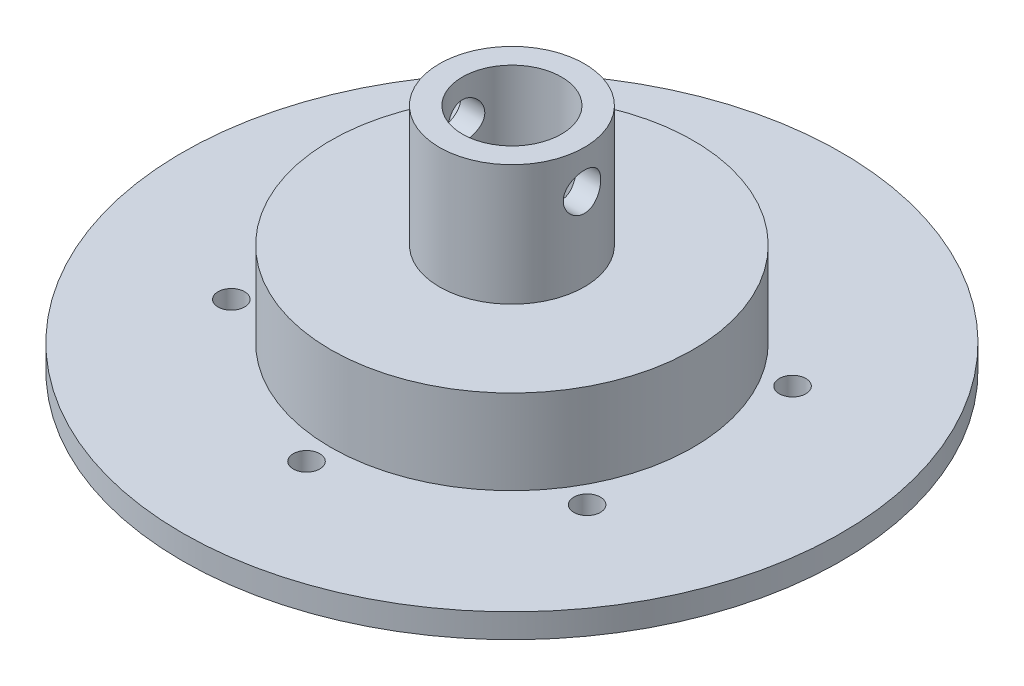
ISO-10303-21;
HEADER;
FILE_DESCRIPTION(('STEP AP214'),'2;1');
FILE_NAME('part.step','',(''),(''),'','','');
FILE_SCHEMA(('AUTOMOTIVE_DESIGN { 1 0 10303 214 1 1 1 1 }'));
ENDSEC;
DATA;
#1=APPLICATION_CONTEXT('core data for automotive mechanical design processes');
#2=APPLICATION_PROTOCOL_DEFINITION('international standard','automotive_design',2000,#1);
#3=PRODUCT_CONTEXT('',#1,'mechanical');
#4=PRODUCT('Part','Part','',(#3));
#5=PRODUCT_RELATED_PRODUCT_CATEGORY('part','',(#4));
#6=PRODUCT_DEFINITION_FORMATION('','',#4);
#7=PRODUCT_DEFINITION_CONTEXT('part definition',#1,'design');
#8=PRODUCT_DEFINITION('design','',#6,#7);
#9=PRODUCT_DEFINITION_SHAPE('','',#8);
#10=(LENGTH_UNIT() NAMED_UNIT(*) SI_UNIT(.MILLI.,.METRE.));
#11=(NAMED_UNIT(*) PLANE_ANGLE_UNIT() SI_UNIT($,.RADIAN.));
#12=(NAMED_UNIT(*) SI_UNIT($,.STERADIAN.) SOLID_ANGLE_UNIT());
#13=UNCERTAINTY_MEASURE_WITH_UNIT(LENGTH_MEASURE(1.E-05),#10,'distance_accuracy_value','');
#14=(GEOMETRIC_REPRESENTATION_CONTEXT(3) GLOBAL_UNCERTAINTY_ASSIGNED_CONTEXT((#13)) GLOBAL_UNIT_ASSIGNED_CONTEXT((#10,
#11,#12)) REPRESENTATION_CONTEXT('',''));
#15=CARTESIAN_POINT('',(0.,0.,0.));
#16=DIRECTION('',(0.,0.,1.));
#17=DIRECTION('',(1.,0.,0.));
#18=AXIS2_PLACEMENT_3D('',#15,#16,#17);
#19=CARTESIAN_POINT('',(0.,2.,0.));
#20=DIRECTION('',(0.,-1.,0.));
#21=DIRECTION('',(0.,0.,-1.));
#22=AXIS2_PLACEMENT_3D('',#19,#20,#21);
#23=CYLINDRICAL_SURFACE('',#22,12.5);
#24=CARTESIAN_POINT('',(0.,2.,0.));
#25=DIRECTION('',(0.,1.,0.));
#26=DIRECTION('',(0.,0.,1.));
#27=AXIS2_PLACEMENT_3D('',#24,#25,#26);
#28=CIRCLE('',#27,12.5);
#29=CARTESIAN_POINT('',(0.,2.,12.5));
#30=VERTEX_POINT('',#29);
#31=EDGE_CURVE('E149',#30,#30,#28,.T.);
#32=ORIENTED_EDGE('',*,*,#31,.T.);
#33=EDGE_LOOP('',(#32));
#34=FACE_BOUND('',#33,.T.);
#35=CARTESIAN_POINT('',(0.,0.,0.));
#36=DIRECTION('',(0.,1.,0.));
#37=DIRECTION('',(0.,0.,1.));
#38=AXIS2_PLACEMENT_3D('',#35,#36,#37);
#39=CIRCLE('',#38,12.5);
#40=CARTESIAN_POINT('',(0.,0.,12.5));
#41=VERTEX_POINT('',#40);
#42=EDGE_CURVE('E146',#41,#41,#39,.T.);
#43=ORIENTED_EDGE('',*,*,#42,.F.);
#44=EDGE_LOOP('',(#43));
#45=FACE_BOUND('',#44,.T.);
#46=ADVANCED_FACE('F45',(#34,#45),#23,.F.);
#47=CARTESIAN_POINT('',(0.,2.,0.));
#48=DIRECTION('',(0.,-1.,0.));
#49=DIRECTION('',(0.,0.,-1.));
#50=AXIS2_PLACEMENT_3D('',#47,#48,#49);
#51=CYLINDRICAL_SURFACE('',#50,27.2742442742849);
#52=CARTESIAN_POINT('',(0.,2.,0.));
#53=DIRECTION('',(0.,1.,0.));
#54=DIRECTION('',(0.,0.,1.));
#55=AXIS2_PLACEMENT_3D('',#52,#53,#54);
#56=CIRCLE('',#55,27.2742442742849);
#57=CARTESIAN_POINT('',(0.,2.,27.2742442742849));
#58=VERTEX_POINT('',#57);
#59=EDGE_CURVE('E58',#58,#58,#56,.T.);
#60=ORIENTED_EDGE('',*,*,#59,.F.);
#61=EDGE_LOOP('',(#60));
#62=FACE_BOUND('',#61,.T.);
#63=CARTESIAN_POINT('',(0.,0.,0.));
#64=DIRECTION('',(0.,1.,0.));
#65=DIRECTION('',(0.,0.,1.));
#66=AXIS2_PLACEMENT_3D('',#63,#64,#65);
#67=CIRCLE('',#66,27.2742442742849);
#68=CARTESIAN_POINT('',(0.,0.,27.2742442742849));
#69=VERTEX_POINT('',#68);
#70=EDGE_CURVE('E64',#69,#69,#67,.T.);
#71=ORIENTED_EDGE('',*,*,#70,.T.);
#72=EDGE_LOOP('',(#71));
#73=FACE_BOUND('',#72,.T.);
#74=ADVANCED_FACE('F130',(#62,#73),#51,.T.);
#75=CARTESIAN_POINT('',(0.,2.,0.));
#76=DIRECTION('',(0.,1.,0.));
#77=DIRECTION('',(0.,0.,1.));
#78=AXIS2_PLACEMENT_3D('',#75,#76,#77);
#79=PLANE('',#78);
#80=CARTESIAN_POINT('',(0.,2.,-17.));
#81=DIRECTION('',(0.,1.,0.));
#82=DIRECTION('',(0.,0.,1.));
#83=AXIS2_PLACEMENT_3D('',#80,#81,#82);
#84=CIRCLE('',#83,1.1);
#85=CARTESIAN_POINT('',(0.,2.,-15.9));
#86=VERTEX_POINT('',#85);
#87=EDGE_CURVE('E399',#86,#86,#84,.F.);
#88=ORIENTED_EDGE('',*,*,#87,.T.);
#89=EDGE_LOOP('',(#88));
#90=FACE_BOUND('',#89,.T.);
#91=CARTESIAN_POINT('',(-14.722431864335,2.,-8.49999999999916));
#92=DIRECTION('',(0.,1.,0.));
#93=DIRECTION('',(0.,0.,1.));
#94=AXIS2_PLACEMENT_3D('',#91,#92,#93);
#95=CIRCLE('',#94,1.10000000000091);
#96=CARTESIAN_POINT('',(-14.722431864335,2.,-7.39999999999825));
#97=VERTEX_POINT('',#96);
#98=EDGE_CURVE('E442',#97,#97,#95,.F.);
#99=ORIENTED_EDGE('',*,*,#98,.T.);
#100=EDGE_LOOP('',(#99));
#101=FACE_BOUND('',#100,.T.);
#102=CARTESIAN_POINT('',(-14.722431864334,2.,8.50000000000084));
#103=DIRECTION('',(0.,1.,0.));
#104=DIRECTION('',(0.,0.,1.));
#105=AXIS2_PLACEMENT_3D('',#102,#103,#104);
#106=CIRCLE('',#105,1.10000000000178);
#107=CARTESIAN_POINT('',(-14.722431864334,2.,9.60000000000262));
#108=VERTEX_POINT('',#107);
#109=EDGE_CURVE('E438',#108,#108,#106,.F.);
#110=ORIENTED_EDGE('',*,*,#109,.T.);
#111=EDGE_LOOP('',(#110));
#112=FACE_BOUND('',#111,.T.);
#113=CARTESIAN_POINT('',(1.92643054259182E-12,2.,17.));
#114=DIRECTION('',(0.,1.,0.));
#115=DIRECTION('',(0.,0.,1.));
#116=AXIS2_PLACEMENT_3D('',#113,#114,#115);
#117=CIRCLE('',#116,1.10000000000196);
#118=CARTESIAN_POINT('',(1.92643054259182E-12,2.,18.100000000002));
#119=VERTEX_POINT('',#118);
#120=EDGE_CURVE('E434',#119,#119,#117,.F.);
#121=ORIENTED_EDGE('',*,*,#120,.T.);
#122=EDGE_LOOP('',(#121));
#123=FACE_BOUND('',#122,.T.);
#124=CARTESIAN_POINT('',(14.7224318643369,2.,8.49999999999917));
#125=DIRECTION('',(0.,1.,0.));
#126=DIRECTION('',(0.,0.,1.));
#127=AXIS2_PLACEMENT_3D('',#124,#125,#126);
#128=CIRCLE('',#127,1.10000000000122);
#129=CARTESIAN_POINT('',(14.7224318643369,2.,9.60000000000038));
#130=VERTEX_POINT('',#129);
#131=EDGE_CURVE('E410',#130,#130,#128,.F.);
#132=ORIENTED_EDGE('',*,*,#131,.T.);
#133=EDGE_LOOP('',(#132));
#134=FACE_BOUND('',#133,.T.);
#135=CARTESIAN_POINT('',(14.7224318643359,2.,-8.50000000000084));
#136=DIRECTION('',(0.,1.,0.));
#137=DIRECTION('',(0.,0.,1.));
#138=AXIS2_PLACEMENT_3D('',#135,#136,#137);
#139=CIRCLE('',#138,1.10000000000026);
#140=CARTESIAN_POINT('',(14.7224318643359,2.,-7.40000000000058));
#141=VERTEX_POINT('',#140);
#142=EDGE_CURVE('E404',#141,#141,#139,.F.);
#143=ORIENTED_EDGE('',*,*,#142,.T.);
#144=EDGE_LOOP('',(#143));
#145=FACE_BOUND('',#144,.T.);
#146=CARTESIAN_POINT('',(0.,2.,0.));
#147=DIRECTION('',(0.,1.,0.));
#148=DIRECTION('',(0.,0.,1.));
#149=AXIS2_PLACEMENT_3D('',#146,#147,#148);
#150=CIRCLE('',#149,15.);
#151=CARTESIAN_POINT('',(0.,2.,15.));
#152=VERTEX_POINT('',#151);
#153=EDGE_CURVE('E157',#152,#152,#150,.T.);
#154=ORIENTED_EDGE('',*,*,#153,.F.);
#155=EDGE_LOOP('',(#154));
#156=FACE_BOUND('',#155,.T.);
#157=ORIENTED_EDGE('',*,*,#59,.T.);
#158=EDGE_LOOP('',(#157));
#159=FACE_BOUND('',#158,.T.);
#160=ADVANCED_FACE('F127',(#90,#101,#112,#123,#134,#145,#156,#159),#79,.T.);
#161=CARTESIAN_POINT('',(0.,0.,0.));
#162=DIRECTION('',(0.,1.,0.));
#163=DIRECTION('',(0.,0.,1.));
#164=AXIS2_PLACEMENT_3D('',#161,#162,#163);
#165=PLANE('',#164);
#166=CARTESIAN_POINT('',(0.,0.,-17.));
#167=DIRECTION('',(0.,1.,0.));
#168=DIRECTION('',(0.,0.,1.));
#169=AXIS2_PLACEMENT_3D('',#166,#167,#168);
#170=CIRCLE('',#169,1.1);
#171=CARTESIAN_POINT('',(0.,0.,-15.9));
#172=VERTEX_POINT('',#171);
#173=EDGE_CURVE('E402',#172,#172,#170,.T.);
#174=ORIENTED_EDGE('',*,*,#173,.T.);
#175=EDGE_LOOP('',(#174));
#176=FACE_BOUND('',#175,.T.);
#177=CARTESIAN_POINT('',(-14.722431864335,0.,-8.49999999999916));
#178=DIRECTION('',(0.,1.,0.));
#179=DIRECTION('',(0.,0.,1.));
#180=AXIS2_PLACEMENT_3D('',#177,#178,#179);
#181=CIRCLE('',#180,1.10000000000091);
#182=CARTESIAN_POINT('',(-14.722431864335,0.,-7.39999999999825));
#183=VERTEX_POINT('',#182);
#184=EDGE_CURVE('E416',#183,#183,#181,.T.);
#185=ORIENTED_EDGE('',*,*,#184,.T.);
#186=EDGE_LOOP('',(#185));
#187=FACE_BOUND('',#186,.T.);
#188=CARTESIAN_POINT('',(-14.722431864334,0.,8.50000000000084));
#189=DIRECTION('',(0.,1.,0.));
#190=DIRECTION('',(0.,0.,1.));
#191=AXIS2_PLACEMENT_3D('',#188,#189,#190);
#192=CIRCLE('',#191,1.10000000000178);
#193=CARTESIAN_POINT('',(-14.722431864334,0.,9.60000000000262));
#194=VERTEX_POINT('',#193);
#195=EDGE_CURVE('E419',#194,#194,#192,.T.);
#196=ORIENTED_EDGE('',*,*,#195,.T.);
#197=EDGE_LOOP('',(#196));
#198=FACE_BOUND('',#197,.T.);
#199=CARTESIAN_POINT('',(1.92643054259182E-12,0.,17.));
#200=DIRECTION('',(0.,1.,0.));
#201=DIRECTION('',(0.,0.,1.));
#202=AXIS2_PLACEMENT_3D('',#199,#200,#201);
#203=CIRCLE('',#202,1.10000000000196);
#204=CARTESIAN_POINT('',(1.92643054259182E-12,0.,18.100000000002));
#205=VERTEX_POINT('',#204);
#206=EDGE_CURVE('E424',#205,#205,#203,.T.);
#207=ORIENTED_EDGE('',*,*,#206,.T.);
#208=EDGE_LOOP('',(#207));
#209=FACE_BOUND('',#208,.T.);
#210=CARTESIAN_POINT('',(14.7224318643369,0.,8.49999999999917));
#211=DIRECTION('',(0.,1.,0.));
#212=DIRECTION('',(0.,0.,1.));
#213=AXIS2_PLACEMENT_3D('',#210,#211,#212);
#214=CIRCLE('',#213,1.10000000000122);
#215=CARTESIAN_POINT('',(14.7224318643369,0.,9.60000000000038));
#216=VERTEX_POINT('',#215);
#217=EDGE_CURVE('E413',#216,#216,#214,.T.);
#218=ORIENTED_EDGE('',*,*,#217,.T.);
#219=EDGE_LOOP('',(#218));
#220=FACE_BOUND('',#219,.T.);
#221=CARTESIAN_POINT('',(14.7224318643359,0.,-8.50000000000084));
#222=DIRECTION('',(0.,1.,0.));
#223=DIRECTION('',(0.,0.,1.));
#224=AXIS2_PLACEMENT_3D('',#221,#222,#223);
#225=CIRCLE('',#224,1.10000000000026);
#226=CARTESIAN_POINT('',(14.7224318643359,0.,-7.40000000000058));
#227=VERTEX_POINT('',#226);
#228=EDGE_CURVE('E405',#227,#227,#225,.T.);
#229=ORIENTED_EDGE('',*,*,#228,.T.);
#230=EDGE_LOOP('',(#229));
#231=FACE_BOUND('',#230,.T.);
#232=ORIENTED_EDGE('',*,*,#42,.T.);
#233=EDGE_LOOP('',(#232));
#234=FACE_BOUND('',#233,.T.);
#235=ORIENTED_EDGE('',*,*,#70,.F.);
#236=EDGE_LOOP('',(#235));
#237=FACE_BOUND('',#236,.T.);
#238=ADVANCED_FACE('F117',(#176,#187,#198,#209,#220,#231,#234,#237),#165,.F.);
#239=CARTESIAN_POINT('',(0.,9.,0.));
#240=DIRECTION('',(0.,1.,0.));
#241=DIRECTION('',(0.,0.,1.));
#242=AXIS2_PLACEMENT_3D('',#239,#240,#241);
#243=PLANE('',#242);
#244=CARTESIAN_POINT('',(0.,9.,0.));
#245=DIRECTION('',(0.,1.,0.));
#246=DIRECTION('',(0.,0.,1.));
#247=AXIS2_PLACEMENT_3D('',#244,#245,#246);
#248=CIRCLE('',#247,6.);
#249=CARTESIAN_POINT('',(0.,9.,6.));
#250=VERTEX_POINT('',#249);
#251=EDGE_CURVE('E165',#250,#250,#248,.T.);
#252=ORIENTED_EDGE('',*,*,#251,.F.);
#253=EDGE_LOOP('',(#252));
#254=FACE_BOUND('',#253,.T.);
#255=CARTESIAN_POINT('',(0.,9.,0.));
#256=DIRECTION('',(0.,1.,0.));
#257=DIRECTION('',(0.,0.,1.));
#258=AXIS2_PLACEMENT_3D('',#255,#256,#257);
#259=CIRCLE('',#258,15.);
#260=CARTESIAN_POINT('',(0.,9.,15.));
#261=VERTEX_POINT('',#260);
#262=EDGE_CURVE('E154',#261,#261,#259,.T.);
#263=ORIENTED_EDGE('',*,*,#262,.T.);
#264=EDGE_LOOP('',(#263));
#265=FACE_BOUND('',#264,.T.);
#266=ADVANCED_FACE('F112',(#254,#265),#243,.T.);
#267=CARTESIAN_POINT('',(0.,9.,0.));
#268=DIRECTION('',(0.,-1.,0.));
#269=DIRECTION('',(0.,0.,-1.));
#270=AXIS2_PLACEMENT_3D('',#267,#268,#269);
#271=CYLINDRICAL_SURFACE('',#270,15.);
#272=ORIENTED_EDGE('',*,*,#262,.F.);
#273=EDGE_LOOP('',(#272));
#274=FACE_BOUND('',#273,.T.);
#275=ORIENTED_EDGE('',*,*,#153,.T.);
#276=EDGE_LOOP('',(#275));
#277=FACE_BOUND('',#276,.T.);
#278=ADVANCED_FACE('F116',(#274,#277),#271,.T.);
#279=CARTESIAN_POINT('',(0.,2.,0.));
#280=DIRECTION('',(0.,1.,0.));
#281=DIRECTION('',(0.,0.,1.));
#282=AXIS2_PLACEMENT_3D('',#279,#280,#281);
#283=PLANE('',#282);
#284=CARTESIAN_POINT('',(0.,2.,0.));
#285=DIRECTION('',(0.,-1.,0.));
#286=DIRECTION('',(0.,0.,-1.));
#287=AXIS2_PLACEMENT_3D('',#284,#285,#286);
#288=CIRCLE('',#287,7.5);
#289=CARTESIAN_POINT('',(0.,2.,-7.5));
#290=VERTEX_POINT('',#289);
#291=EDGE_CURVE('E100',#290,#290,#288,.T.);
#292=ORIENTED_EDGE('',*,*,#291,.F.);
#293=EDGE_LOOP('',(#292));
#294=FACE_BOUND('',#293,.T.);
#295=ORIENTED_EDGE('',*,*,#31,.F.);
#296=EDGE_LOOP('',(#295));
#297=FACE_BOUND('',#296,.T.);
#298=ADVANCED_FACE('F120',(#294,#297),#283,.F.);
#299=CARTESIAN_POINT('',(0.,19.,0.));
#300=DIRECTION('',(0.,1.,0.));
#301=DIRECTION('',(0.,0.,1.));
#302=AXIS2_PLACEMENT_3D('',#299,#300,#301);
#303=PLANE('',#302);
#304=CARTESIAN_POINT('',(0.,19.,0.));
#305=DIRECTION('',(0.,1.,0.));
#306=DIRECTION('',(0.,0.,1.));
#307=AXIS2_PLACEMENT_3D('',#304,#305,#306);
#308=CIRCLE('',#307,6.);
#309=CARTESIAN_POINT('',(0.,19.,6.));
#310=VERTEX_POINT('',#309);
#311=EDGE_CURVE('E161',#310,#310,#308,.T.);
#312=ORIENTED_EDGE('',*,*,#311,.T.);
#313=EDGE_LOOP('',(#312));
#314=FACE_BOUND('',#313,.T.);
#315=CARTESIAN_POINT('',(0.,19.,0.));
#316=DIRECTION('',(0.,1.,0.));
#317=DIRECTION('',(0.,0.,1.));
#318=AXIS2_PLACEMENT_3D('',#315,#316,#317);
#319=CIRCLE('',#318,4.1);
#320=CARTESIAN_POINT('',(0.,19.,4.1));
#321=VERTEX_POINT('',#320);
#322=EDGE_CURVE('E169',#321,#321,#319,.T.);
#323=ORIENTED_EDGE('',*,*,#322,.F.);
#324=EDGE_LOOP('',(#323));
#325=FACE_BOUND('',#324,.T.);
#326=ADVANCED_FACE('F110',(#314,#325),#303,.T.);
#327=CARTESIAN_POINT('',(0.,19.,0.));
#328=DIRECTION('',(0.,-1.,0.));
#329=DIRECTION('',(0.,0.,-1.));
#330=AXIS2_PLACEMENT_3D('',#327,#328,#329);
#331=CYLINDRICAL_SURFACE('',#330,6.);
#332=CARTESIAN_POINT('',(-5.79633504897707,15.818596456159,-1.55));
#333=CARTESIAN_POINT('',(-5.79633661604596,15.9040870905214,-1.54999774561704));
#334=CARTESIAN_POINT('',(-5.79824707702891,15.9896021218388,-1.54290301936433));
#335=CARTESIAN_POINT('',(-5.80566134638855,16.1581695939792,-1.51476100618114));
#336=CARTESIAN_POINT('',(-5.8111671031582,16.2412206739894,-1.49370615376646));
#337=CARTESIAN_POINT('',(-5.82510772314797,16.4023975100887,-1.43837641408219));
#338=CARTESIAN_POINT('',(-5.83353863803459,16.4805297384609,-1.40411934009938));
#339=CARTESIAN_POINT('',(-5.85237464979213,16.6299484044475,-1.3234126266569));
#340=CARTESIAN_POINT('',(-5.86277986502739,16.7012344312285,-1.27696225611394));
#341=CARTESIAN_POINT('',(-5.88466575958071,16.836611251975,-1.17202166514603));
#342=CARTESIAN_POINT('',(-5.89616455979493,16.9005175072335,-1.11329711501732));
#343=CARTESIAN_POINT('',(-5.9187851954122,17.0176922217987,-0.985979494210384));
#344=CARTESIAN_POINT('',(-5.92990699362712,17.0709596341927,-0.917385453468769));
#345=CARTESIAN_POINT('',(-5.95072183741225,17.166106753857,-0.771004170994654));
#346=CARTESIAN_POINT('',(-5.96039100922924,17.2078041020723,-0.693094707718737));
#347=CARTESIAN_POINT('',(-5.97700382998799,17.2774399936775,-0.531080303294777));
#348=CARTESIAN_POINT('',(-5.98394790920881,17.3053807093512,-0.446976342720886));
#349=CARTESIAN_POINT('',(-5.99420001835036,17.3461160798522,-0.276885367103386));
#350=CARTESIAN_POINT('',(-5.99758323349779,17.359224378886,-0.190978077833731));
#351=CARTESIAN_POINT('',(-6.00059484994249,17.3709084489763,-0.0181216103858163));
#352=CARTESIAN_POINT('',(-6.00022384247458,17.3694865083314,0.0688274015822511));
#353=CARTESIAN_POINT('',(-5.99582435082941,17.3523737238168,0.239120018995549));
#354=CARTESIAN_POINT('',(-5.99188268833877,17.3370215828566,0.322500243828174));
#355=CARTESIAN_POINT('',(-5.98088653424113,17.2930299723023,0.485458383908401));
#356=CARTESIAN_POINT('',(-5.9738318708847,17.2643897695792,0.565036089096163));
#357=CARTESIAN_POINT('',(-5.95727155620565,17.1943681340575,0.719008949169403));
#358=CARTESIAN_POINT('',(-5.9477432833266,17.1528683819896,0.793347763471505));
#359=CARTESIAN_POINT('',(-5.92726592189155,17.0583959398081,0.934123330338745));
#360=CARTESIAN_POINT('',(-5.91631657148661,17.0054211340851,1.00055862225958));
#361=CARTESIAN_POINT('',(-5.8938141920939,16.8876953021764,1.12566219320472));
#362=CARTESIAN_POINT('',(-5.88225286056917,16.8226485624267,1.18405101619255));
#363=CARTESIAN_POINT('',(-5.86011668744095,16.6835661794243,1.2891569008143));
#364=CARTESIAN_POINT('',(-5.84954189862138,16.6095300556912,1.33587333815367));
#365=CARTESIAN_POINT('',(-5.83054459100921,16.4539939784849,1.41650376820232));
#366=CARTESIAN_POINT('',(-5.82213417930304,16.372455360985,1.45034622947371));
#367=CARTESIAN_POINT('',(-5.80857065445023,16.20457525652,1.50375347937329));
#368=CARTESIAN_POINT('',(-5.80341679026275,16.1182348819607,1.52332156018949));
#369=CARTESIAN_POINT('',(-5.79710871209302,15.9458045983762,1.54715203869978));
#370=CARTESIAN_POINT('',(-5.79584608247047,15.859775944406,1.55182943874833));
#371=CARTESIAN_POINT('',(-5.79716757577838,15.6881665135294,1.54688551372432));
#372=CARTESIAN_POINT('',(-5.79975131765827,15.6025856930999,1.53726560505113));
#373=CARTESIAN_POINT('',(-5.80837012988762,15.4358706871362,1.50436500739166));
#374=CARTESIAN_POINT('',(-5.81434313484917,15.3546845410095,1.48132978966476));
#375=CARTESIAN_POINT('',(-5.82900769773325,15.1973270022972,1.42252650790292));
#376=CARTESIAN_POINT('',(-5.83769959419064,15.1211562356175,1.38675685820062));
#377=CARTESIAN_POINT('',(-5.85704801458277,14.9742441538615,1.30264435155056));
#378=CARTESIAN_POINT('',(-5.86774162733935,14.903648645629,1.25405555077342));
#379=CARTESIAN_POINT('',(-5.88979944116253,14.7714606856043,1.14599195327321));
#380=CARTESIAN_POINT('',(-5.90116375999625,14.70986982155,1.0865152409002));
#381=CARTESIAN_POINT('',(-5.92365280797419,14.5957379169694,0.95645214765174));
#382=CARTESIAN_POINT('',(-5.93476285317967,14.5434851116678,0.885609809309284));
#383=CARTESIAN_POINT('',(-5.95517624565337,14.4516154911963,0.735916702503082));
#384=CARTESIAN_POINT('',(-5.96447968846628,14.4119980077184,0.657066357890073));
#385=CARTESIAN_POINT('',(-5.98017214809089,14.3468781256551,0.494147340531282));
#386=CARTESIAN_POINT('',(-5.98658251474297,14.3212720195027,0.41012227510036));
#387=CARTESIAN_POINT('',(-5.99586027253599,14.2845952508732,0.238772827357831));
#388=CARTESIAN_POINT('',(-5.99872839709067,14.2735215794565,0.151449131880656));
#389=CARTESIAN_POINT('',(-6.0005662563181,14.2664028113495,-0.0213184512426025));
#390=CARTESIAN_POINT('',(-5.99964600070264,14.269933633271,-0.106743950449605));
#391=CARTESIAN_POINT('',(-5.9942568314865,14.2909457144342,-0.275741150189934));
#392=CARTESIAN_POINT('',(-5.98978803677726,14.3084265062917,-0.359312912735035));
#393=CARTESIAN_POINT('',(-5.97782332609427,14.3566086360643,-0.521753732814644));
#394=CARTESIAN_POINT('',(-5.97034604660067,14.3872286574528,-0.600648372829211));
#395=CARTESIAN_POINT('',(-5.95314895439004,14.4607469747031,-0.752225222417623));
#396=CARTESIAN_POINT('',(-5.94342884278627,14.5036469072071,-0.824906602222466));
#397=CARTESIAN_POINT('',(-5.92248299280681,14.6017749149338,-0.963986818519657));
#398=CARTESIAN_POINT('',(-5.91122537503475,14.6572875203753,-1.03018009771606));
#399=CARTESIAN_POINT('',(-5.8886094646594,14.7785189559859,-1.15245541020698));
#400=CARTESIAN_POINT('',(-5.87725114682509,14.8442404163372,-1.20853482972478));
#401=CARTESIAN_POINT('',(-5.85545616778492,14.9856277874324,-1.31011171849256));
#402=CARTESIAN_POINT('',(-5.84504286520679,15.0614683207528,-1.35537155873463));
#403=CARTESIAN_POINT('',(-5.82663861972953,15.2199411738845,-1.43243247625023));
#404=CARTESIAN_POINT('',(-5.81864600217376,15.302568747809,-1.4642428640644));
#405=CARTESIAN_POINT('',(-5.8071690500245,15.4572449756515,-1.50904592757997));
#406=CARTESIAN_POINT('',(-5.80313798897001,15.5285867461386,-1.52436897573479));
#407=CARTESIAN_POINT('',(-5.79772045079217,15.6728120182065,-1.54484647137972));
#408=CARTESIAN_POINT('',(-5.79633371267831,15.745695366918,-1.5500019223974));
#409=CARTESIAN_POINT('',(-5.79633504897707,15.818596456159,-1.55));
#410=B_SPLINE_CURVE_WITH_KNOTS('',3,(#332,#333,#334,#335,#336,#337,#338,#339,#340,#341,#342,
#343,#344,#345,#346,#347,#348,#349,#350,#351,#352,#353,#354,#355,#356,#357,#358,#359,#360,#361,
#362,#363,#364,#365,#366,#367,#368,#369,#370,#371,#372,#373,#374,#375,#376,#377,#378,#379,#380,
#381,#382,#383,#384,#385,#386,#387,#388,#389,#390,#391,#392,#393,#394,#395,#396,#397,#398,#399,
#400,#401,#402,#403,#404,#405,#406,#407,#408,#409),.UNSPECIFIED.,.T.,.F.,(4,2,2,2,2,2,2,2,2,2,2,
2,2,2,2,2,2,2,2,2,2,2,2,2,2,2,2,2,2,2,2,2,2,2,2,2,2,2,4),(0.,0.256204016353737,
0.512546992300906,0.768545297943089,1.0245589561888,1.28599912627693,1.54746501066116,
1.81284398870783,2.07818104781024,2.337795861759,2.59736979083056,2.8507966844607,
3.10423756182242,3.36008326763613,3.6159761829001,3.87925342032545,4.14254473605326,
4.407278317248,4.67195082199025,4.92917925091306,5.1863821985438,5.43902050038028,
5.6916902712686,5.94961321433791,6.20758158079008,6.47249403663949,6.73739247840392,
7.00030275331392,7.26315858407671,7.51843606806669,7.77370499951663,8.02741639647247,
8.2811616233391,8.54132880352907,8.80156312401176,9.0670742435755,9.33240125781845,
9.5508976547842,9.76937248538278),.UNSPECIFIED.);
#411=CARTESIAN_POINT('',(-5.79633504897707,15.818596456159,-1.55));
#412=VERTEX_POINT('',#411);
#413=EDGE_CURVE('E99',#412,#412,#410,.T.);
#414=ORIENTED_EDGE('',*,*,#413,.T.);
#415=EDGE_LOOP('',(#414));
#416=FACE_BOUND('',#415,.T.);
#417=CARTESIAN_POINT('',(5.79633504897707,15.818596456159,-1.55));
#418=CARTESIAN_POINT('',(5.79633661604596,15.7331058217965,-1.54999774561704));
#419=CARTESIAN_POINT('',(5.79824707702891,15.6475907904792,-1.54290301936433));
#420=CARTESIAN_POINT('',(5.80566134638855,15.4790233183388,-1.51476100618114));
#421=CARTESIAN_POINT('',(5.8111671031582,15.3959722383285,-1.49370615376646));
#422=CARTESIAN_POINT('',(5.82510772314797,15.2347954022293,-1.43837641408219));
#423=CARTESIAN_POINT('',(5.8335386380346,15.156663173857,-1.40411934009938));
#424=CARTESIAN_POINT('',(5.85237464979213,15.0072445078704,-1.3234126266569));
#425=CARTESIAN_POINT('',(5.86277986502739,14.9359584810895,-1.27696225611394));
#426=CARTESIAN_POINT('',(5.88466575958071,14.8005816603429,-1.17202166514603));
#427=CARTESIAN_POINT('',(5.89616455979493,14.7366754050845,-1.11329711501732));
#428=CARTESIAN_POINT('',(5.9187851954122,14.6195006905193,-0.985979494210384));
#429=CARTESIAN_POINT('',(5.92990699362712,14.5662332781253,-0.91738545346877));
#430=CARTESIAN_POINT('',(5.95072183741225,14.471086158461,-0.771004170994655));
#431=CARTESIAN_POINT('',(5.96039100922924,14.4293888102457,-0.693094707718738));
#432=CARTESIAN_POINT('',(5.97700382998799,14.3597529186405,-0.531080303294778));
#433=CARTESIAN_POINT('',(5.98394790920881,14.3318122029668,-0.446976342720886));
#434=CARTESIAN_POINT('',(5.99420001835036,14.2910768324658,-0.276885367103385));
#435=CARTESIAN_POINT('',(5.99758323349779,14.277968533432,-0.190978077833731));
#436=CARTESIAN_POINT('',(6.00059484994249,14.2662844633417,-0.0181216103858156));
#437=CARTESIAN_POINT('',(6.00022384247458,14.2677064039866,0.068827401582252));
#438=CARTESIAN_POINT('',(5.99582435082941,14.2848191885012,0.23912001899555));
#439=CARTESIAN_POINT('',(5.99188268833877,14.3001713294613,0.322500243828174));
#440=CARTESIAN_POINT('',(5.98088653424113,14.3441629400156,0.485458383908401));
#441=CARTESIAN_POINT('',(5.97383187088469,14.3728031427388,0.565036089096164));
#442=CARTESIAN_POINT('',(5.95727155620565,14.4428247782605,0.719008949169405));
#443=CARTESIAN_POINT('',(5.9477432833266,14.4843245303284,0.793347763471507));
#444=CARTESIAN_POINT('',(5.92726592189155,14.5787969725099,0.934123330338747));
#445=CARTESIAN_POINT('',(5.91631657148661,14.6317717782329,1.00055862225958));
#446=CARTESIAN_POINT('',(5.8938141920939,14.7494976101416,1.12566219320472));
#447=CARTESIAN_POINT('',(5.88225286056917,14.8145443498912,1.18405101619255));
#448=CARTESIAN_POINT('',(5.86011668744095,14.9536267328936,1.2891569008143));
#449=CARTESIAN_POINT('',(5.84954189862139,15.0276628566267,1.33587333815367));
#450=CARTESIAN_POINT('',(5.83054459100921,15.1831989338331,1.41650376820232));
#451=CARTESIAN_POINT('',(5.82213417930304,15.264737551333,1.45034622947371));
#452=CARTESIAN_POINT('',(5.80857065445023,15.432617655798,1.50375347937329));
#453=CARTESIAN_POINT('',(5.80341679026275,15.5189580303573,1.52332156018949));
#454=CARTESIAN_POINT('',(5.79710871209302,15.6913883139418,1.54715203869978));
#455=CARTESIAN_POINT('',(5.79584608247047,15.7774169679119,1.55182943874833));
#456=CARTESIAN_POINT('',(5.79716757577838,15.9490263987886,1.54688551372432));
#457=CARTESIAN_POINT('',(5.79975131765827,16.034607219218,1.53726560505113));
#458=CARTESIAN_POINT('',(5.80837012988762,16.2013222251818,1.50436500739166));
#459=CARTESIAN_POINT('',(5.81434313484917,16.2825083713085,1.48132978966476));
#460=CARTESIAN_POINT('',(5.82900769773326,16.4398659100207,1.42252650790292));
#461=CARTESIAN_POINT('',(5.83769959419064,16.5160366767005,1.38675685820062));
#462=CARTESIAN_POINT('',(5.85704801458277,16.6629487584565,1.30264435155056));
#463=CARTESIAN_POINT('',(5.86774162733935,16.733544266689,1.25405555077342));
#464=CARTESIAN_POINT('',(5.88979944116253,16.8657322267137,1.14599195327321));
#465=CARTESIAN_POINT('',(5.90116375999625,16.927323090768,1.0865152409002));
#466=CARTESIAN_POINT('',(5.92365280797419,17.0414549953486,0.956452147651737));
#467=CARTESIAN_POINT('',(5.93476285317968,17.0937078006502,0.885609809309282));
#468=CARTESIAN_POINT('',(5.95517624565337,17.1855774211217,0.73591670250308));
#469=CARTESIAN_POINT('',(5.96447968846628,17.2251949045996,0.657066357890072));
#470=CARTESIAN_POINT('',(5.98017214809089,17.2903147866628,0.49414734053128));
#471=CARTESIAN_POINT('',(5.98658251474297,17.3159208928153,0.410122275100358));
#472=CARTESIAN_POINT('',(5.99586027253599,17.3525976614448,0.23877282735783));
#473=CARTESIAN_POINT('',(5.99872839709067,17.3636713328614,0.151449131880655));
#474=CARTESIAN_POINT('',(6.0005662563181,17.3707901009685,-0.0213184512426031));
#475=CARTESIAN_POINT('',(5.99964600070264,17.367259279047,-0.106743950449606));
#476=CARTESIAN_POINT('',(5.9942568314865,17.3462471978838,-0.275741150189934));
#477=CARTESIAN_POINT('',(5.98978803677726,17.3287664060263,-0.359312912735036));
#478=CARTESIAN_POINT('',(5.97782332609427,17.2805842762537,-0.521753732814646));
#479=CARTESIAN_POINT('',(5.97034604660067,17.2499642548651,-0.600648372829213));
#480=CARTESIAN_POINT('',(5.95314895439004,17.1764459376149,-0.752225222417625));
#481=CARTESIAN_POINT('',(5.94342884278627,17.1335460051108,-0.824906602222468));
#482=CARTESIAN_POINT('',(5.92248299280681,17.0354179973842,-0.963986818519658));
#483=CARTESIAN_POINT('',(5.91122537503475,16.9799053919427,-1.03018009771606));
#484=CARTESIAN_POINT('',(5.8886094646594,16.8586739563321,-1.15245541020698));
#485=CARTESIAN_POINT('',(5.87725114682509,16.7929524959808,-1.20853482972478));
#486=CARTESIAN_POINT('',(5.85545616778492,16.6515651248856,-1.31011171849257));
#487=CARTESIAN_POINT('',(5.84504286520679,16.5757245915651,-1.35537155873464));
#488=CARTESIAN_POINT('',(5.82663861972953,16.4172517384334,-1.43243247625023));
#489=CARTESIAN_POINT('',(5.81864600217376,16.334624164509,-1.4642428640644));
#490=CARTESIAN_POINT('',(5.8071690500245,16.1799479366665,-1.50904592757997));
#491=CARTESIAN_POINT('',(5.80313798897001,16.1086061661794,-1.52436897573479));
#492=CARTESIAN_POINT('',(5.79772045079217,15.9643808941114,-1.54484647137972));
#493=CARTESIAN_POINT('',(5.79633371267831,15.8914975454,-1.5500019223974));
#494=CARTESIAN_POINT('',(5.79633504897707,15.818596456159,-1.55));
#495=B_SPLINE_CURVE_WITH_KNOTS('',3,(#417,#418,#419,#420,#421,#422,#423,#424,#425,#426,#427,
#428,#429,#430,#431,#432,#433,#434,#435,#436,#437,#438,#439,#440,#441,#442,#443,#444,#445,#446,
#447,#448,#449,#450,#451,#452,#453,#454,#455,#456,#457,#458,#459,#460,#461,#462,#463,#464,#465,
#466,#467,#468,#469,#470,#471,#472,#473,#474,#475,#476,#477,#478,#479,#480,#481,#482,#483,#484,
#485,#486,#487,#488,#489,#490,#491,#492,#493,#494),.UNSPECIFIED.,.T.,.F.,(4,2,2,2,2,2,2,2,2,2,2,
2,2,2,2,2,2,2,2,2,2,2,2,2,2,2,2,2,2,2,2,2,2,2,2,2,2,2,4),(0.,0.256204016353741,
0.512546992300906,0.76854529794309,1.0245589561888,1.28599912627693,1.54746501066116,
1.81284398870783,2.07818104781024,2.337795861759,2.59736979083056,2.8507966844607,
3.10423756182242,3.36008326763613,3.6159761829001,3.87925342032546,4.14254473605325,
4.40727831724801,4.67195082199025,4.92917925091306,5.18638219854379,5.43902050038029,
5.6916902712686,5.94961321433791,6.20758158079008,6.47249403663949,6.73739247840393,
7.00030275331392,7.26315858407671,7.51843606806669,7.77370499951663,8.02741639647247,
8.28116162333911,8.54132880352907,8.80156312401177,9.0670742435755,9.33240125781846,
9.55089765478421,9.76937248538278),.UNSPECIFIED.);
#496=CARTESIAN_POINT('',(5.79633504897707,15.818596456159,-1.55));
#497=VERTEX_POINT('',#496);
#498=EDGE_CURVE('E91',#497,#497,#495,.T.);
#499=ORIENTED_EDGE('',*,*,#498,.T.);
#500=EDGE_LOOP('',(#499));
#501=FACE_BOUND('',#500,.T.);
#502=ORIENTED_EDGE('',*,*,#311,.F.);
#503=EDGE_LOOP('',(#502));
#504=FACE_BOUND('',#503,.T.);
#505=ORIENTED_EDGE('',*,*,#251,.T.);
#506=EDGE_LOOP('',(#505));
#507=FACE_BOUND('',#506,.T.);
#508=ADVANCED_FACE('F106',(#416,#501,#504,#507),#331,.T.);
#509=CARTESIAN_POINT('',(0.,19.,0.));
#510=DIRECTION('',(0.,-1.,0.));
#511=DIRECTION('',(0.,0.,-1.));
#512=AXIS2_PLACEMENT_3D('',#509,#510,#511);
#513=CYLINDRICAL_SURFACE('',#512,4.1);
#514=CARTESIAN_POINT('',(-3.79572127533095,15.818596456159,-1.55));
#515=CARTESIAN_POINT('',(-3.79571807869718,15.9022479900472,-1.55000339439521));
#516=CARTESIAN_POINT('',(-3.79851658268941,15.9858773742275,-1.54320568035831));
#517=CARTESIAN_POINT('',(-3.80932782097356,16.1506114846596,-1.51632100819543));
#518=CARTESIAN_POINT('',(-3.81734033295925,16.2317163183945,-1.49623461664945));
#519=CARTESIAN_POINT('',(-3.83754499883588,16.3889751493671,-1.44361752349635));
#520=CARTESIAN_POINT('',(-3.84972698369388,16.4651406606157,-1.41111707667978));
#521=CARTESIAN_POINT('',(-3.87688147963516,16.6109679370332,-1.33470186367526));
#522=CARTESIAN_POINT('',(-3.89185484291163,16.680627706259,-1.29078361007084));
#523=CARTESIAN_POINT('',(-3.92375261374464,16.8149863211997,-1.19040262073553));
#524=CARTESIAN_POINT('',(-3.94073505904399,16.8793100920582,-1.13345616475358));
#525=CARTESIAN_POINT('',(-3.97425377401878,16.9977596538599,-1.00966113746994));
#526=CARTESIAN_POINT('',(-3.99078994584183,17.0518832235684,-0.94281041502535));
#527=CARTESIAN_POINT('',(-4.02224423851187,17.1502111833824,-0.798249289847608));
#528=CARTESIAN_POINT('',(-4.03708640422139,17.1940067140412,-0.720242780653525));
#529=CARTESIAN_POINT('',(-4.06278161390768,17.2676971125574,-0.557308823178987));
#530=CARTESIAN_POINT('',(-4.07363606545869,17.2975968862969,-0.472383829926182));
#531=CARTESIAN_POINT('',(-4.08972074820579,17.3413280656722,-0.301967682278236));
#532=CARTESIAN_POINT('',(-4.09517634231386,17.3558054607885,-0.216663984994907));
#533=CARTESIAN_POINT('',(-4.10065808358103,17.3703519923252,-0.0446750083911245));
#534=CARTESIAN_POINT('',(-4.10068602505427,17.3704258903619,0.0420098048720864));
#535=CARTESIAN_POINT('',(-4.09545191905348,17.3565368887092,0.209665451966113));
#536=CARTESIAN_POINT('',(-4.09045571961851,17.3432794079619,0.29070447386326));
#537=CARTESIAN_POINT('',(-4.07608453825882,17.3042921819784,0.449309186557453));
#538=CARTESIAN_POINT('',(-4.06670924570385,17.2785615519565,0.526874630529));
#539=CARTESIAN_POINT('',(-4.04433584783908,17.2150368998234,0.677678763459993));
#540=CARTESIAN_POINT('',(-4.03128674826472,17.1770719003855,0.750837551756558));
#541=CARTESIAN_POINT('',(-4.00288318015243,17.0903085407272,0.889928600569416));
#542=CARTESIAN_POINT('',(-3.98752796197258,17.0415066553203,0.95585849911442));
#543=CARTESIAN_POINT('',(-3.95501590495618,16.9310688640236,1.08277130385237));
#544=CARTESIAN_POINT('',(-3.93780622798661,16.8688429996361,1.14322808233196));
#545=CARTESIAN_POINT('',(-3.9042507602385,16.735036924599,1.25304865423422));
#546=CARTESIAN_POINT('',(-3.88790519461707,16.6634542926121,1.3024095672535));
#547=CARTESIAN_POINT('',(-3.85759245158263,16.5108580351563,1.38966540461987));
#548=CARTESIAN_POINT('',(-3.84368824662066,16.4296661053714,1.42727215525196));
#549=CARTESIAN_POINT('',(-3.82056170483146,16.2614372940273,1.4880790580652));
#550=CARTESIAN_POINT('',(-3.81133671205663,16.1744037600359,1.51128738454711));
#551=CARTESIAN_POINT('',(-3.79924178249506,16.0021680080167,1.54143199698391));
#552=CARTESIAN_POINT('',(-3.79604539613466,15.9171354246673,1.54920544108389));
#553=CARTESIAN_POINT('',(-3.79544474957857,15.7469393760659,1.55067800289713));
#554=CARTESIAN_POINT('',(-3.79803900765081,15.6617759498671,1.54438072108072));
#555=CARTESIAN_POINT('',(-3.80839537728683,15.4980712355861,1.51865003362181));
#556=CARTESIAN_POINT('',(-3.81590043414639,15.4194091939327,1.49986933282285));
#557=CARTESIAN_POINT('',(-3.8349262296446,15.2663907212486,1.45052917693449));
#558=CARTESIAN_POINT('',(-3.8464477990875,15.19203518472,1.41996728480055));
#559=CARTESIAN_POINT('',(-3.87274491382622,15.0466071233773,1.34663089487617));
#560=CARTESIAN_POINT('',(-3.88762718299422,14.9757656345486,1.30343765536613));
#561=CARTESIAN_POINT('',(-3.91879149329845,14.8420393158938,1.2065080507606));
#562=CARTESIAN_POINT('',(-3.93507405266922,14.779157453319,1.15276777278748));
#563=CARTESIAN_POINT('',(-3.9684756306253,14.6589194522933,1.03216170261497));
#564=CARTESIAN_POINT('',(-3.9855807138758,14.6021829165133,0.964672167174277));
#565=CARTESIAN_POINT('',(-4.01769389540809,14.5007636637161,0.820711693044676));
#566=CARTESIAN_POINT('',(-4.03270197857186,14.4560810335977,0.744240689612446));
#567=CARTESIAN_POINT('',(-4.05892592748736,14.380318748628,0.584502304193095));
#568=CARTESIAN_POINT('',(-4.07015350366596,14.3491969980979,0.501256920088924));
#569=CARTESIAN_POINT('',(-4.08758488949781,14.3015773763674,0.330190207053845));
#570=CARTESIAN_POINT('',(-4.09379110336876,14.285072506277,0.242371089480814));
#571=CARTESIAN_POINT('',(-4.10024926643563,14.2679190217031,0.0702455478256755));
#572=CARTESIAN_POINT('',(-4.10083156463127,14.2663906070733,-0.0139615710891524));
#573=CARTESIAN_POINT('',(-4.09684131823074,14.2769631539353,-0.181382500644682));
#574=CARTESIAN_POINT('',(-4.09226941261615,14.2890624259631,-0.26459643312123));
#575=CARTESIAN_POINT('',(-4.07863693438304,14.3259274898267,-0.425543571842302));
#576=CARTESIAN_POINT('',(-4.06969198489219,14.3503675120508,-0.503361940020294));
#577=CARTESIAN_POINT('',(-4.04825000717867,14.4108938668017,-0.653797433718316));
#578=CARTESIAN_POINT('',(-4.03575230629853,14.4469824049668,-0.726413571015083));
#579=CARTESIAN_POINT('',(-4.00779441594161,14.5315178979995,-0.867752457634743));
#580=CARTESIAN_POINT('',(-3.99223119530134,14.5804234313603,-0.936180164115303));
#581=CARTESIAN_POINT('',(-3.96004948764996,14.6884857018444,-1.06412779847969));
#582=CARTESIAN_POINT('',(-3.94343062291349,14.7476461215606,-1.12364451201226));
#583=CARTESIAN_POINT('',(-3.90991283529091,14.8783248675551,-1.23538204963716));
#584=CARTESIAN_POINT('',(-3.89304702208639,14.9503371086389,-1.28703741075625));
#585=CARTESIAN_POINT('',(-3.86195264345992,15.1025516008191,-1.37754139138689));
#586=CARTESIAN_POINT('',(-3.84772443555095,15.1827549598951,-1.41638827533426));
#587=CARTESIAN_POINT('',(-3.82313120197821,15.3535104003807,-1.48153825614599));
#588=CARTESIAN_POINT('',(-3.81299947392684,15.4443813573441,-1.50710285352211));
#589=CARTESIAN_POINT('',(-3.79929858150045,15.6297114529221,-1.54132597021863));
#590=CARTESIAN_POINT('',(-3.79572488378813,15.7241680667612,-1.54999616830371));
#591=CARTESIAN_POINT('',(-3.79572127533095,15.818596456159,-1.55));
#592=B_SPLINE_CURVE_WITH_KNOTS('',3,(#514,#515,#516,#517,#518,#519,#520,#521,#522,#523,#524,
#525,#526,#527,#528,#529,#530,#531,#532,#533,#534,#535,#536,#537,#538,#539,#540,#541,#542,#543,
#544,#545,#546,#547,#548,#549,#550,#551,#552,#553,#554,#555,#556,#557,#558,#559,#560,#561,#562,
#563,#564,#565,#566,#567,#568,#569,#570,#571,#572,#573,#574,#575,#576,#577,#578,#579,#580,#581,
#582,#583,#584,#585,#586,#587,#588,#589,#590,#591),.UNSPECIFIED.,.T.,.F.,(4,2,2,2,2,2,2,2,2,2,2,
2,2,2,2,2,2,2,2,2,2,2,2,2,2,2,2,2,2,2,2,2,2,2,2,2,2,2,4),(0.,0.250602829530859,
0.501194974973534,0.75118024931698,1.00124196821019,1.26279491678834,1.52440475648896,
1.79508278149681,2.06566517118479,2.32440498677656,2.58305926607317,2.82871143969564,
3.07438104126224,3.32364472838828,3.57298961887486,3.83713880398441,4.10135648125513,
4.37161929982462,4.64172854352834,4.89673724496045,5.15168070127893,5.39424474839884,
5.63685899900503,5.888663019155,6.14056063403195,6.40873498331065,6.67691126585494,
6.9442490399114,7.21145873733083,7.46286973459023,7.71424956712665,7.95931565068144,
8.20442816457502,8.45991922112628,8.71550221688415,8.98484819700015,9.25423065883883,
9.53731449576384,9.82020257289997),.UNSPECIFIED.);
#593=CARTESIAN_POINT('',(-3.79572127533095,15.818596456159,-1.55));
#594=VERTEX_POINT('',#593);
#595=EDGE_CURVE('E48',#594,#594,#592,.T.);
#596=ORIENTED_EDGE('',*,*,#595,.F.);
#597=EDGE_LOOP('',(#596));
#598=FACE_BOUND('',#597,.T.);
#599=CARTESIAN_POINT('',(3.79572127533095,15.818596456159,-1.55));
#600=CARTESIAN_POINT('',(3.79571807869718,15.7349449222707,-1.55000339439521));
#601=CARTESIAN_POINT('',(3.79851658268941,15.6513155380905,-1.54320568035831));
#602=CARTESIAN_POINT('',(3.80932782097356,15.4865814276584,-1.51632100819543));
#603=CARTESIAN_POINT('',(3.81734033295925,15.4054765939234,-1.49623461664945));
#604=CARTESIAN_POINT('',(3.83754499883588,15.2482177629508,-1.44361752349635));
#605=CARTESIAN_POINT('',(3.84972698369388,15.1720522517023,-1.41111707667978));
#606=CARTESIAN_POINT('',(3.87688147963516,15.0262249752847,-1.33470186367526));
#607=CARTESIAN_POINT('',(3.89185484291163,14.9565652060589,-1.29078361007084));
#608=CARTESIAN_POINT('',(3.92375261374464,14.8222065911183,-1.19040262073553));
#609=CARTESIAN_POINT('',(3.94073505904399,14.7578828202598,-1.13345616475357));
#610=CARTESIAN_POINT('',(3.97425377401878,14.6394332584581,-1.00966113746993));
#611=CARTESIAN_POINT('',(3.99078994584183,14.5853096887495,-0.942810415025347));
#612=CARTESIAN_POINT('',(4.02224423851187,14.4869817289356,-0.798249289847606));
#613=CARTESIAN_POINT('',(4.03708640422139,14.4431861982767,-0.720242780653522));
#614=CARTESIAN_POINT('',(4.06278161390768,14.3694957997606,-0.557308823178985));
#615=CARTESIAN_POINT('',(4.0736360654587,14.3395960260211,-0.47238382992618));
#616=CARTESIAN_POINT('',(4.08972074820579,14.2958648466457,-0.301967682278235));
#617=CARTESIAN_POINT('',(4.09517634231386,14.2813874515295,-0.216663984994906));
#618=CARTESIAN_POINT('',(4.10065808358103,14.2668409199928,-0.044675008391123));
#619=CARTESIAN_POINT('',(4.10068602505427,14.2667670219561,0.0420098048720878));
#620=CARTESIAN_POINT('',(4.09545191905348,14.2806560236088,0.209665451966114));
#621=CARTESIAN_POINT('',(4.09045571961851,14.293913504356,0.290704473863261));
#622=CARTESIAN_POINT('',(4.07608453825882,14.3329007303395,0.449309186557454));
#623=CARTESIAN_POINT('',(4.06670924570385,14.3586313603615,0.526874630529001));
#624=CARTESIAN_POINT('',(4.04433584783908,14.4221560124946,0.677678763459993));
#625=CARTESIAN_POINT('',(4.03128674826472,14.4601210119325,0.750837551756558));
#626=CARTESIAN_POINT('',(4.00288318015243,14.5468843715908,0.889928600569416));
#627=CARTESIAN_POINT('',(3.98752796197258,14.5956862569976,0.95585849911442));
#628=CARTESIAN_POINT('',(3.95501590495618,14.7061240482943,1.08277130385237));
#629=CARTESIAN_POINT('',(3.93780622798661,14.7683499126818,1.14322808233197));
#630=CARTESIAN_POINT('',(3.9042507602385,14.9021559877189,1.25304865423423));
#631=CARTESIAN_POINT('',(3.88790519461707,14.9737386197059,1.3024095672535));
#632=CARTESIAN_POINT('',(3.85759245158263,15.1263348771617,1.38966540461987));
#633=CARTESIAN_POINT('',(3.84368824662066,15.2075268069466,1.42727215525196));
#634=CARTESIAN_POINT('',(3.82056170483146,15.3757556182907,1.4880790580652));
#635=CARTESIAN_POINT('',(3.81133671205663,15.4627891522821,1.51128738454711));
#636=CARTESIAN_POINT('',(3.79924178249506,15.6350249043012,1.54143199698391));
#637=CARTESIAN_POINT('',(3.79604539613466,15.7200574876506,1.54920544108389));
#638=CARTESIAN_POINT('',(3.79544474957857,15.890253536252,1.55067800289713));
#639=CARTESIAN_POINT('',(3.79803900765081,15.9754169624509,1.54438072108072));
#640=CARTESIAN_POINT('',(3.80839537728683,16.1391216767318,1.51865003362181));
#641=CARTESIAN_POINT('',(3.81590043414639,16.2177837183853,1.49986933282285));
#642=CARTESIAN_POINT('',(3.8349262296446,16.3708021910693,1.45052917693449));
#643=CARTESIAN_POINT('',(3.8464477990875,16.445157727598,1.41996728480055));
#644=CARTESIAN_POINT('',(3.87274491382622,16.5905857889407,1.34663089487617));
#645=CARTESIAN_POINT('',(3.88762718299422,16.6614272777694,1.30343765536613));
#646=CARTESIAN_POINT('',(3.91879149329845,16.7951535964242,1.2065080507606));
#647=CARTESIAN_POINT('',(3.93507405266922,16.858035458999,1.15276777278748));
#648=CARTESIAN_POINT('',(3.9684756306253,16.9782734600246,1.03216170261497));
#649=CARTESIAN_POINT('',(3.9855807138758,17.0350099958047,0.964672167174273));
#650=CARTESIAN_POINT('',(4.0176938954081,17.1364292486019,0.820711693044672));
#651=CARTESIAN_POINT('',(4.03270197857186,17.1811118787203,0.744240689612445));
#652=CARTESIAN_POINT('',(4.05892592748736,17.2568741636899,0.584502304193095));
#653=CARTESIAN_POINT('',(4.07015350366596,17.28799591422,0.501256920088924));
#654=CARTESIAN_POINT('',(4.08758488949781,17.3356155359505,0.330190207053844));
#655=CARTESIAN_POINT('',(4.09379110336876,17.3521204060409,0.242371089480814));
#656=CARTESIAN_POINT('',(4.10024926643563,17.3692738906149,0.0702455478256741));
#657=CARTESIAN_POINT('',(4.10083156463127,17.3708023052447,-0.013961571089154));
#658=CARTESIAN_POINT('',(4.09684131823074,17.3602297583826,-0.181382500644683));
#659=CARTESIAN_POINT('',(4.09226941261615,17.3481304863549,-0.264596433121231));
#660=CARTESIAN_POINT('',(4.07863693438304,17.3112654224913,-0.425543571842302));
#661=CARTESIAN_POINT('',(4.06969198489218,17.2868254002672,-0.503361940020294));
#662=CARTESIAN_POINT('',(4.04825000717867,17.2262990455163,-0.653797433718316));
#663=CARTESIAN_POINT('',(4.03575230629853,17.1902105073512,-0.726413571015083));
#664=CARTESIAN_POINT('',(4.00779441594161,17.1056750143185,-0.867752457634744));
#665=CARTESIAN_POINT('',(3.99223119530134,17.0567694809577,-0.936180164115303));
#666=CARTESIAN_POINT('',(3.96004948764996,16.9487072104735,-1.06412779847969));
#667=CARTESIAN_POINT('',(3.94343062291349,16.8895467907574,-1.12364451201226));
#668=CARTESIAN_POINT('',(3.90991283529091,16.7588680447629,-1.23538204963716));
#669=CARTESIAN_POINT('',(3.89304702208639,16.6868558036791,-1.28703741075625));
#670=CARTESIAN_POINT('',(3.86195264345993,16.5346413114989,-1.37754139138689));
#671=CARTESIAN_POINT('',(3.84772443555095,16.4544379524229,-1.41638827533426));
#672=CARTESIAN_POINT('',(3.82313120197821,16.2836825119373,-1.48153825614599));
#673=CARTESIAN_POINT('',(3.81299947392684,16.1928115549739,-1.50710285352211));
#674=CARTESIAN_POINT('',(3.79929858150045,16.0074814593959,-1.54132597021863));
#675=CARTESIAN_POINT('',(3.79572488378813,15.9130248455568,-1.54999616830371));
#676=CARTESIAN_POINT('',(3.79572127533095,15.818596456159,-1.55));
#677=B_SPLINE_CURVE_WITH_KNOTS('',3,(#599,#600,#601,#602,#603,#604,#605,#606,#607,#608,#609,
#610,#611,#612,#613,#614,#615,#616,#617,#618,#619,#620,#621,#622,#623,#624,#625,#626,#627,#628,
#629,#630,#631,#632,#633,#634,#635,#636,#637,#638,#639,#640,#641,#642,#643,#644,#645,#646,#647,
#648,#649,#650,#651,#652,#653,#654,#655,#656,#657,#658,#659,#660,#661,#662,#663,#664,#665,#666,
#667,#668,#669,#670,#671,#672,#673,#674,#675,#676),.UNSPECIFIED.,.T.,.F.,(4,2,2,2,2,2,2,2,2,2,2,
2,2,2,2,2,2,2,2,2,2,2,2,2,2,2,2,2,2,2,2,2,2,2,2,2,2,2,4),(0.,0.250602829530856,
0.501194974973534,0.751180249316981,1.00124196821019,1.26279491678834,1.52440475648896,
1.79508278149681,2.0656651711848,2.32440498677656,2.58305926607317,2.82871143969565,
3.07438104126224,3.32364472838828,3.57298961887487,3.83713880398441,4.10135648125513,
4.37161929982462,4.64172854352834,4.89673724496045,5.15168070127893,5.39424474839884,
5.63685899900503,5.888663019155,6.14056063403196,6.40873498331065,6.67691126585494,
6.9442490399114,7.21145873733084,7.46286973459023,7.71424956712665,7.95931565068144,
8.20442816457502,8.45991922112628,8.71550221688415,8.98484819700015,9.25423065883883,
9.53731449576384,9.82020257289997),.UNSPECIFIED.);
#678=CARTESIAN_POINT('',(3.79572127533095,15.818596456159,-1.55));
#679=VERTEX_POINT('',#678);
#680=EDGE_CURVE('E68',#679,#679,#677,.T.);
#681=ORIENTED_EDGE('',*,*,#680,.F.);
#682=EDGE_LOOP('',(#681));
#683=FACE_BOUND('',#682,.T.);
#684=ORIENTED_EDGE('',*,*,#322,.T.);
#685=EDGE_LOOP('',(#684));
#686=FACE_BOUND('',#685,.T.);
#687=CARTESIAN_POINT('',(0.,9.,0.));
#688=DIRECTION('',(0.,1.,0.));
#689=DIRECTION('',(0.,0.,1.));
#690=AXIS2_PLACEMENT_3D('',#687,#688,#689);
#691=CIRCLE('',#690,4.1);
#692=CARTESIAN_POINT('',(0.,9.,4.1));
#693=VERTEX_POINT('',#692);
#694=EDGE_CURVE('E10',#693,#693,#691,.F.);
#695=ORIENTED_EDGE('',*,*,#694,.T.);
#696=EDGE_LOOP('',(#695));
#697=FACE_BOUND('',#696,.T.);
#698=ADVANCED_FACE('F75',(#598,#683,#686,#697),#513,.F.);
#699=ORIENTED_EDGE('',*,*,#694,.F.);
#700=EDGE_LOOP('',(#699));
#701=FACE_BOUND('',#700,.T.);
#702=ADVANCED_FACE('F119',(#701),#243,.T.);
#703=CARTESIAN_POINT('',(-27.2742442742849,15.818596456159,0.));
#704=DIRECTION('',(1.,0.,0.));
#705=DIRECTION('',(0.,0.,-1.));
#706=AXIS2_PLACEMENT_3D('',#703,#704,#705);
#707=CYLINDRICAL_SURFACE('',#706,1.55);
#708=ORIENTED_EDGE('',*,*,#680,.T.);
#709=EDGE_LOOP('',(#708));
#710=FACE_BOUND('',#709,.T.);
#711=ORIENTED_EDGE('',*,*,#498,.F.);
#712=EDGE_LOOP('',(#711));
#713=FACE_BOUND('',#712,.T.);
#714=ADVANCED_FACE('F83',(#710,#713),#707,.F.);
#715=ORIENTED_EDGE('',*,*,#595,.T.);
#716=EDGE_LOOP('',(#715));
#717=FACE_BOUND('',#716,.T.);
#718=ORIENTED_EDGE('',*,*,#413,.F.);
#719=EDGE_LOOP('',(#718));
#720=FACE_BOUND('',#719,.T.);
#721=ADVANCED_FACE('F78',(#717,#720),#707,.F.);
#722=CARTESIAN_POINT('',(0.,7.,0.));
#723=DIRECTION('',(0.,-1.,0.));
#724=DIRECTION('',(0.,0.,-1.));
#725=AXIS2_PLACEMENT_3D('',#722,#723,#724);
#726=CYLINDRICAL_SURFACE('',#725,7.5);
#727=CARTESIAN_POINT('',(0.,7.,0.));
#728=DIRECTION('',(0.,-1.,0.));
#729=DIRECTION('',(0.,0.,-1.));
#730=AXIS2_PLACEMENT_3D('',#727,#728,#729);
#731=CIRCLE('',#730,7.5);
#732=CARTESIAN_POINT('',(0.,7.,-7.5));
#733=VERTEX_POINT('',#732);
#734=EDGE_CURVE('E74',#733,#733,#731,.T.);
#735=ORIENTED_EDGE('',*,*,#734,.F.);
#736=EDGE_LOOP('',(#735));
#737=FACE_BOUND('',#736,.T.);
#738=ORIENTED_EDGE('',*,*,#291,.T.);
#739=EDGE_LOOP('',(#738));
#740=FACE_BOUND('',#739,.T.);
#741=ADVANCED_FACE('F82',(#737,#740),#726,.F.);
#742=CARTESIAN_POINT('',(0.,7.,0.));
#743=DIRECTION('',(0.,-1.,0.));
#744=DIRECTION('',(0.,0.,-1.));
#745=AXIS2_PLACEMENT_3D('',#742,#743,#744);
#746=PLANE('',#745);
#747=ORIENTED_EDGE('',*,*,#734,.T.);
#748=EDGE_LOOP('',(#747));
#749=FACE_BOUND('',#748,.T.);
#750=ADVANCED_FACE('F232',(#749),#746,.T.);
#751=CARTESIAN_POINT('',(14.7224318643359,19.,-8.50000000000084));
#752=DIRECTION('',(0.,-1.,0.));
#753=DIRECTION('',(0.,0.,-1.));
#754=AXIS2_PLACEMENT_3D('',#751,#752,#753);
#755=CYLINDRICAL_SURFACE('',#754,1.10000000000026);
#756=ORIENTED_EDGE('',*,*,#142,.F.);
#757=EDGE_LOOP('',(#756));
#758=FACE_BOUND('',#757,.T.);
#759=ORIENTED_EDGE('',*,*,#228,.F.);
#760=EDGE_LOOP('',(#759));
#761=FACE_BOUND('',#760,.T.);
#762=ADVANCED_FACE('F239',(#758,#761),#755,.F.);
#763=CARTESIAN_POINT('',(14.7224318643369,19.,8.49999999999917));
#764=DIRECTION('',(0.,-1.,0.));
#765=DIRECTION('',(0.,0.,-1.));
#766=AXIS2_PLACEMENT_3D('',#763,#764,#765);
#767=CYLINDRICAL_SURFACE('',#766,1.10000000000122);
#768=ORIENTED_EDGE('',*,*,#131,.F.);
#769=EDGE_LOOP('',(#768));
#770=FACE_BOUND('',#769,.T.);
#771=ORIENTED_EDGE('',*,*,#217,.F.);
#772=EDGE_LOOP('',(#771));
#773=FACE_BOUND('',#772,.T.);
#774=ADVANCED_FACE('F247',(#770,#773),#767,.F.);
#775=CARTESIAN_POINT('',(1.92643054259182E-12,19.,17.));
#776=DIRECTION('',(0.,-1.,0.));
#777=DIRECTION('',(0.,0.,-1.));
#778=AXIS2_PLACEMENT_3D('',#775,#776,#777);
#779=CYLINDRICAL_SURFACE('',#778,1.10000000000196);
#780=ORIENTED_EDGE('',*,*,#120,.F.);
#781=EDGE_LOOP('',(#780));
#782=FACE_BOUND('',#781,.T.);
#783=ORIENTED_EDGE('',*,*,#206,.F.);
#784=EDGE_LOOP('',(#783));
#785=FACE_BOUND('',#784,.T.);
#786=ADVANCED_FACE('F256',(#782,#785),#779,.F.);
#787=CARTESIAN_POINT('',(-14.722431864334,19.,8.50000000000084));
#788=DIRECTION('',(0.,-1.,0.));
#789=DIRECTION('',(0.,0.,-1.));
#790=AXIS2_PLACEMENT_3D('',#787,#788,#789);
#791=CYLINDRICAL_SURFACE('',#790,1.10000000000178);
#792=ORIENTED_EDGE('',*,*,#109,.F.);
#793=EDGE_LOOP('',(#792));
#794=FACE_BOUND('',#793,.T.);
#795=ORIENTED_EDGE('',*,*,#195,.F.);
#796=EDGE_LOOP('',(#795));
#797=FACE_BOUND('',#796,.T.);
#798=ADVANCED_FACE('F264',(#794,#797),#791,.F.);
#799=CARTESIAN_POINT('',(-14.722431864335,19.,-8.49999999999916));
#800=DIRECTION('',(0.,-1.,0.));
#801=DIRECTION('',(0.,0.,-1.));
#802=AXIS2_PLACEMENT_3D('',#799,#800,#801);
#803=CYLINDRICAL_SURFACE('',#802,1.10000000000091);
#804=ORIENTED_EDGE('',*,*,#98,.F.);
#805=EDGE_LOOP('',(#804));
#806=FACE_BOUND('',#805,.T.);
#807=ORIENTED_EDGE('',*,*,#184,.F.);
#808=EDGE_LOOP('',(#807));
#809=FACE_BOUND('',#808,.T.);
#810=ADVANCED_FACE('F272',(#806,#809),#803,.F.);
#811=CARTESIAN_POINT('',(0.,19.,-17.));
#812=DIRECTION('',(0.,-1.,0.));
#813=DIRECTION('',(0.,0.,-1.));
#814=AXIS2_PLACEMENT_3D('',#811,#812,#813);
#815=CYLINDRICAL_SURFACE('',#814,1.1);
#816=ORIENTED_EDGE('',*,*,#87,.F.);
#817=EDGE_LOOP('',(#816));
#818=FACE_BOUND('',#817,.T.);
#819=ORIENTED_EDGE('',*,*,#173,.F.);
#820=EDGE_LOOP('',(#819));
#821=FACE_BOUND('',#820,.T.);
#822=ADVANCED_FACE('F280',(#818,#821),#815,.F.);
#823=CLOSED_SHELL('',(#46,#74,#160,#238,#266,#278,#298,#326,#508,#698,#702,#714,#721,#741,#750,
#762,#774,#786,#798,#810,#822));
#824=MANIFOLD_SOLID_BREP('B2',#823);
#825=ADVANCED_BREP_SHAPE_REPRESENTATION('',(#18,#824),#14);
#826=SHAPE_DEFINITION_REPRESENTATION(#9,#825);
ENDSEC;
END-ISO-10303-21;
